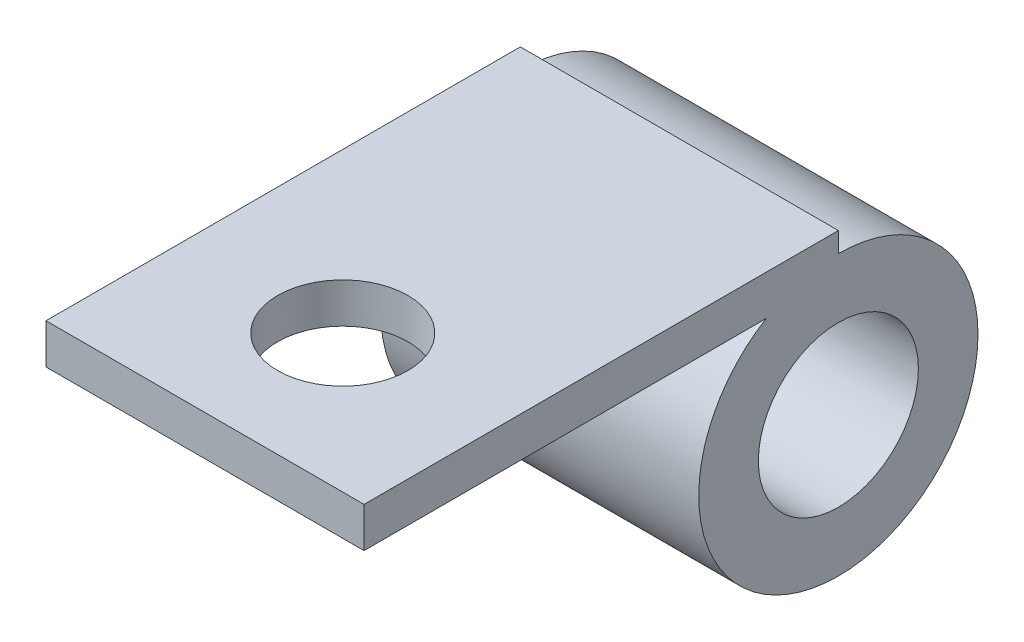
ISO-10303-21;
HEADER;
FILE_DESCRIPTION(('STEP AP214'),'2;1');
FILE_NAME('part.step','',(''),(''),'','','');
FILE_SCHEMA(('AUTOMOTIVE_DESIGN { 1 0 10303 214 1 1 1 1 }'));
ENDSEC;
DATA;
#1=APPLICATION_CONTEXT('core data for automotive mechanical design processes');
#2=APPLICATION_PROTOCOL_DEFINITION('international standard','automotive_design',2000,#1);
#3=PRODUCT_CONTEXT('',#1,'mechanical');
#4=PRODUCT('Part','Part','',(#3));
#5=PRODUCT_RELATED_PRODUCT_CATEGORY('part','',(#4));
#6=PRODUCT_DEFINITION_FORMATION('','',#4);
#7=PRODUCT_DEFINITION_CONTEXT('part definition',#1,'design');
#8=PRODUCT_DEFINITION('design','',#6,#7);
#9=PRODUCT_DEFINITION_SHAPE('','',#8);
#10=(LENGTH_UNIT() NAMED_UNIT(*) SI_UNIT(.MILLI.,.METRE.));
#11=(NAMED_UNIT(*) PLANE_ANGLE_UNIT() SI_UNIT($,.RADIAN.));
#12=(NAMED_UNIT(*) SI_UNIT($,.STERADIAN.) SOLID_ANGLE_UNIT());
#13=UNCERTAINTY_MEASURE_WITH_UNIT(LENGTH_MEASURE(1.E-05),#10,'distance_accuracy_value','');
#14=(GEOMETRIC_REPRESENTATION_CONTEXT(3) GLOBAL_UNCERTAINTY_ASSIGNED_CONTEXT((#13)) GLOBAL_UNIT_ASSIGNED_CONTEXT((#10,
#11,#12)) REPRESENTATION_CONTEXT('',''));
#15=CARTESIAN_POINT('',(0.,0.,0.));
#16=DIRECTION('',(0.,0.,1.));
#17=DIRECTION('',(1.,0.,0.));
#18=AXIS2_PLACEMENT_3D('',#15,#16,#17);
#19=CARTESIAN_POINT('',(6.35,0.,0.));
#20=DIRECTION('',(-1.,0.,0.));
#21=DIRECTION('',(0.,0.,1.));
#22=AXIS2_PLACEMENT_3D('',#19,#20,#21);
#23=CYLINDRICAL_SURFACE('',#22,5.575);
#24=DIRECTION('',(-1.,0.,0.));
#25=VECTOR('',#24,1.);
#26=CARTESIAN_POINT('',(6.35,5.575,0.));
#27=LINE('',#26,#25);
#28=CARTESIAN_POINT('',(6.35,5.575,0.));
#29=VERTEX_POINT('',#28);
#30=CARTESIAN_POINT('',(-6.35,5.575,0.));
#31=VERTEX_POINT('',#30);
#32=EDGE_CURVE('E11',#29,#31,#27,.T.);
#33=ORIENTED_EDGE('',*,*,#32,.F.);
#34=CARTESIAN_POINT('',(6.35,0.,0.));
#35=DIRECTION('',(1.,0.,0.));
#36=DIRECTION('',(0.,0.,-1.));
#37=AXIS2_PLACEMENT_3D('',#34,#35,#36);
#38=CIRCLE('',#37,5.575);
#39=CARTESIAN_POINT('',(6.35,4.775,2.87749891398763));
#40=VERTEX_POINT('',#39);
#41=EDGE_CURVE('E47',#40,#29,#38,.T.);
#42=ORIENTED_EDGE('',*,*,#41,.F.);
#43=DIRECTION('',(-1.,0.,0.));
#44=VECTOR('',#43,1.);
#45=CARTESIAN_POINT('',(6.35,4.775,2.87749891398763));
#46=LINE('',#45,#44);
#47=CARTESIAN_POINT('',(-6.35,4.775,2.87749891398763));
#48=VERTEX_POINT('',#47);
#49=EDGE_CURVE('E58',#48,#40,#46,.F.);
#50=ORIENTED_EDGE('',*,*,#49,.F.);
#51=CARTESIAN_POINT('',(-6.35,0.,0.));
#52=DIRECTION('',(1.,0.,0.));
#53=DIRECTION('',(0.,0.,-1.));
#54=AXIS2_PLACEMENT_3D('',#51,#52,#53);
#55=CIRCLE('',#54,5.575);
#56=EDGE_CURVE('E108',#48,#31,#55,.T.);
#57=ORIENTED_EDGE('',*,*,#56,.T.);
#58=EDGE_LOOP('',(#33,#42,#50,#57));
#59=FACE_BOUND('',#58,.T.);
#60=ADVANCED_FACE('F41',(#59),#23,.T.);
#61=CARTESIAN_POINT('',(6.35,0.,0.));
#62=DIRECTION('',(1.,0.,0.));
#63=DIRECTION('',(0.,0.,-1.));
#64=AXIS2_PLACEMENT_3D('',#61,#62,#63);
#65=PLANE('',#64);
#66=CARTESIAN_POINT('',(6.35,0.,0.));
#67=DIRECTION('',(1.,0.,0.));
#68=DIRECTION('',(0.,0.,-1.));
#69=AXIS2_PLACEMENT_3D('',#66,#67,#68);
#70=CIRCLE('',#69,3.195);
#71=CARTESIAN_POINT('',(6.35,0.,-3.195));
#72=VERTEX_POINT('',#71);
#73=EDGE_CURVE('E118',#72,#72,#70,.T.);
#74=ORIENTED_EDGE('',*,*,#73,.F.);
#75=EDGE_LOOP('',(#74));
#76=FACE_BOUND('',#75,.T.);
#77=ORIENTED_EDGE('',*,*,#41,.T.);
#78=DIRECTION('',(0.,1.,0.));
#79=VECTOR('',#78,1.);
#80=CARTESIAN_POINT('',(6.35,6.375,0.));
#81=LINE('',#80,#79);
#82=CARTESIAN_POINT('',(6.35,6.375,0.));
#83=VERTEX_POINT('',#82);
#84=EDGE_CURVE('E84',#29,#83,#81,.T.);
#85=ORIENTED_EDGE('',*,*,#84,.T.);
#86=DIRECTION('',(0.,0.,1.));
#87=VECTOR('',#86,1.);
#88=CARTESIAN_POINT('',(6.35,6.375,18.94));
#89=LINE('',#88,#87);
#90=CARTESIAN_POINT('',(6.35,6.375,18.94));
#91=VERTEX_POINT('',#90);
#92=EDGE_CURVE('E86',#83,#91,#89,.T.);
#93=ORIENTED_EDGE('',*,*,#92,.T.);
#94=DIRECTION('',(0.,-1.,0.));
#95=VECTOR('',#94,1.);
#96=CARTESIAN_POINT('',(6.35,4.775,18.94));
#97=LINE('',#96,#95);
#98=CARTESIAN_POINT('',(6.35,4.775,18.94));
#99=VERTEX_POINT('',#98);
#100=EDGE_CURVE('E105',#91,#99,#97,.T.);
#101=ORIENTED_EDGE('',*,*,#100,.T.);
#102=DIRECTION('',(0.,0.,-1.));
#103=VECTOR('',#102,1.);
#104=CARTESIAN_POINT('',(6.35,4.775,0.));
#105=LINE('',#104,#103);
#106=EDGE_CURVE('E132',#99,#40,#105,.T.);
#107=ORIENTED_EDGE('',*,*,#106,.T.);
#108=EDGE_LOOP('',(#77,#85,#93,#101,#107));
#109=FACE_BOUND('',#108,.T.);
#110=ADVANCED_FACE('F87',(#76,#109),#65,.T.);
#111=CARTESIAN_POINT('',(-6.35,0.,0.));
#112=DIRECTION('',(1.,0.,0.));
#113=DIRECTION('',(0.,0.,-1.));
#114=AXIS2_PLACEMENT_3D('',#111,#112,#113);
#115=PLANE('',#114);
#116=CARTESIAN_POINT('',(-6.35,0.,0.));
#117=DIRECTION('',(1.,0.,0.));
#118=DIRECTION('',(0.,0.,-1.));
#119=AXIS2_PLACEMENT_3D('',#116,#117,#118);
#120=CIRCLE('',#119,3.195);
#121=CARTESIAN_POINT('',(-6.35,0.,-3.195));
#122=VERTEX_POINT('',#121);
#123=EDGE_CURVE('E117',#122,#122,#120,.T.);
#124=ORIENTED_EDGE('',*,*,#123,.T.);
#125=EDGE_LOOP('',(#124));
#126=FACE_BOUND('',#125,.T.);
#127=ORIENTED_EDGE('',*,*,#56,.F.);
#128=DIRECTION('',(0.,0.,-1.));
#129=VECTOR('',#128,1.);
#130=CARTESIAN_POINT('',(-6.35,4.775,0.));
#131=LINE('',#130,#129);
#132=CARTESIAN_POINT('',(-6.35,4.775,18.94));
#133=VERTEX_POINT('',#132);
#134=EDGE_CURVE('E91',#133,#48,#131,.T.);
#135=ORIENTED_EDGE('',*,*,#134,.F.);
#136=DIRECTION('',(0.,-1.,0.));
#137=VECTOR('',#136,1.);
#138=CARTESIAN_POINT('',(-6.35,4.775,18.94));
#139=LINE('',#138,#137);
#140=CARTESIAN_POINT('',(-6.35,6.375,18.94));
#141=VERTEX_POINT('',#140);
#142=EDGE_CURVE('E136',#141,#133,#139,.T.);
#143=ORIENTED_EDGE('',*,*,#142,.F.);
#144=DIRECTION('',(0.,0.,1.));
#145=VECTOR('',#144,1.);
#146=CARTESIAN_POINT('',(-6.35,6.375,18.94));
#147=LINE('',#146,#145);
#148=CARTESIAN_POINT('',(-6.35,6.375,0.));
#149=VERTEX_POINT('',#148);
#150=EDGE_CURVE('E134',#149,#141,#147,.T.);
#151=ORIENTED_EDGE('',*,*,#150,.F.);
#152=DIRECTION('',(0.,1.,0.));
#153=VECTOR('',#152,1.);
#154=CARTESIAN_POINT('',(-6.35,6.375,0.));
#155=LINE('',#154,#153);
#156=EDGE_CURVE('E106',#31,#149,#155,.T.);
#157=ORIENTED_EDGE('',*,*,#156,.F.);
#158=EDGE_LOOP('',(#127,#135,#143,#151,#157));
#159=FACE_BOUND('',#158,.T.);
#160=ADVANCED_FACE('F146',(#126,#159),#115,.F.);
#161=CARTESIAN_POINT('',(6.35,6.375,0.));
#162=DIRECTION('',(0.,0.,1.));
#163=DIRECTION('',(1.,0.,0.));
#164=AXIS2_PLACEMENT_3D('',#161,#162,#163);
#165=PLANE('',#164);
#166=ORIENTED_EDGE('',*,*,#84,.F.);
#167=ORIENTED_EDGE('',*,*,#32,.T.);
#168=ORIENTED_EDGE('',*,*,#156,.T.);
#169=DIRECTION('',(-1.,0.,0.));
#170=VECTOR('',#169,1.);
#171=CARTESIAN_POINT('',(6.35,6.375,0.));
#172=LINE('',#171,#170);
#173=EDGE_CURVE('E98',#83,#149,#172,.T.);
#174=ORIENTED_EDGE('',*,*,#173,.F.);
#175=EDGE_LOOP('',(#166,#167,#168,#174));
#176=FACE_BOUND('',#175,.T.);
#177=ADVANCED_FACE('F102',(#176),#165,.F.);
#178=CARTESIAN_POINT('',(6.35,4.775,0.));
#179=DIRECTION('',(0.,1.,0.));
#180=DIRECTION('',(0.,0.,1.));
#181=AXIS2_PLACEMENT_3D('',#178,#179,#180);
#182=PLANE('',#181);
#183=CARTESIAN_POINT('',(0.,4.775,13.44));
#184=DIRECTION('',(0.,1.,0.));
#185=DIRECTION('',(0.,0.,1.));
#186=AXIS2_PLACEMENT_3D('',#183,#184,#185);
#187=CIRCLE('',#186,2.6);
#188=CARTESIAN_POINT('',(0.,4.775,16.04));
#189=VERTEX_POINT('',#188);
#190=EDGE_CURVE('E119',#189,#189,#187,.T.);
#191=ORIENTED_EDGE('',*,*,#190,.T.);
#192=EDGE_LOOP('',(#191));
#193=FACE_BOUND('',#192,.T.);
#194=ORIENTED_EDGE('',*,*,#134,.T.);
#195=ORIENTED_EDGE('',*,*,#49,.T.);
#196=ORIENTED_EDGE('',*,*,#106,.F.);
#197=DIRECTION('',(-1.,0.,0.));
#198=VECTOR('',#197,1.);
#199=CARTESIAN_POINT('',(6.35,4.775,18.94));
#200=LINE('',#199,#198);
#201=EDGE_CURVE('E112',#99,#133,#200,.T.);
#202=ORIENTED_EDGE('',*,*,#201,.T.);
#203=EDGE_LOOP('',(#194,#195,#196,#202));
#204=FACE_BOUND('',#203,.T.);
#205=ADVANCED_FACE('F145',(#193,#204),#182,.F.);
#206=CARTESIAN_POINT('',(6.35,6.375,18.94));
#207=DIRECTION('',(0.,-1.,0.));
#208=DIRECTION('',(0.,0.,-1.));
#209=AXIS2_PLACEMENT_3D('',#206,#207,#208);
#210=PLANE('',#209);
#211=CARTESIAN_POINT('',(0.,6.375,13.44));
#212=DIRECTION('',(0.,-1.,0.));
#213=DIRECTION('',(0.,0.,-1.));
#214=AXIS2_PLACEMENT_3D('',#211,#212,#213);
#215=CIRCLE('',#214,2.6);
#216=CARTESIAN_POINT('',(0.,6.375,10.84));
#217=VERTEX_POINT('',#216);
#218=EDGE_CURVE('E42',#217,#217,#215,.T.);
#219=ORIENTED_EDGE('',*,*,#218,.T.);
#220=EDGE_LOOP('',(#219));
#221=FACE_BOUND('',#220,.T.);
#222=ORIENTED_EDGE('',*,*,#150,.T.);
#223=DIRECTION('',(-1.,0.,0.));
#224=VECTOR('',#223,1.);
#225=CARTESIAN_POINT('',(6.35,6.375,18.94));
#226=LINE('',#225,#224);
#227=EDGE_CURVE('E99',#91,#141,#226,.T.);
#228=ORIENTED_EDGE('',*,*,#227,.F.);
#229=ORIENTED_EDGE('',*,*,#92,.F.);
#230=ORIENTED_EDGE('',*,*,#173,.T.);
#231=EDGE_LOOP('',(#222,#228,#229,#230));
#232=FACE_BOUND('',#231,.T.);
#233=ADVANCED_FACE('F100',(#221,#232),#210,.F.);
#234=CARTESIAN_POINT('',(6.35,4.775,18.94));
#235=DIRECTION('',(0.,0.,-1.));
#236=DIRECTION('',(-1.,0.,0.));
#237=AXIS2_PLACEMENT_3D('',#234,#235,#236);
#238=PLANE('',#237);
#239=ORIENTED_EDGE('',*,*,#142,.T.);
#240=ORIENTED_EDGE('',*,*,#201,.F.);
#241=ORIENTED_EDGE('',*,*,#100,.F.);
#242=ORIENTED_EDGE('',*,*,#227,.T.);
#243=EDGE_LOOP('',(#239,#240,#241,#242));
#244=FACE_BOUND('',#243,.T.);
#245=ADVANCED_FACE('F164',(#244),#238,.F.);
#246=CARTESIAN_POINT('',(-7.35,0.,0.));
#247=DIRECTION('',(1.,0.,0.));
#248=DIRECTION('',(0.,0.,-1.));
#249=AXIS2_PLACEMENT_3D('',#246,#247,#248);
#250=CYLINDRICAL_SURFACE('',#249,3.195);
#251=ORIENTED_EDGE('',*,*,#73,.T.);
#252=EDGE_LOOP('',(#251));
#253=FACE_BOUND('',#252,.T.);
#254=ORIENTED_EDGE('',*,*,#123,.F.);
#255=EDGE_LOOP('',(#254));
#256=FACE_BOUND('',#255,.T.);
#257=ADVANCED_FACE('F169',(#253,#256),#250,.F.);
#258=CARTESIAN_POINT('',(0.,-20.,13.44));
#259=DIRECTION('',(0.,1.,0.));
#260=DIRECTION('',(0.,0.,1.));
#261=AXIS2_PLACEMENT_3D('',#258,#259,#260);
#262=CYLINDRICAL_SURFACE('',#261,2.6);
#263=ORIENTED_EDGE('',*,*,#218,.F.);
#264=EDGE_LOOP('',(#263));
#265=FACE_BOUND('',#264,.T.);
#266=ORIENTED_EDGE('',*,*,#190,.F.);
#267=EDGE_LOOP('',(#266));
#268=FACE_BOUND('',#267,.T.);
#269=ADVANCED_FACE('F173',(#265,#268),#262,.F.);
#270=CLOSED_SHELL('',(#60,#110,#160,#177,#205,#233,#245,#257,#269));
#271=MANIFOLD_SOLID_BREP('B2',#270);
#272=ADVANCED_BREP_SHAPE_REPRESENTATION('',(#18,#271),#14);
#273=SHAPE_DEFINITION_REPRESENTATION(#9,#272);
ENDSEC;
END-ISO-10303-21;
